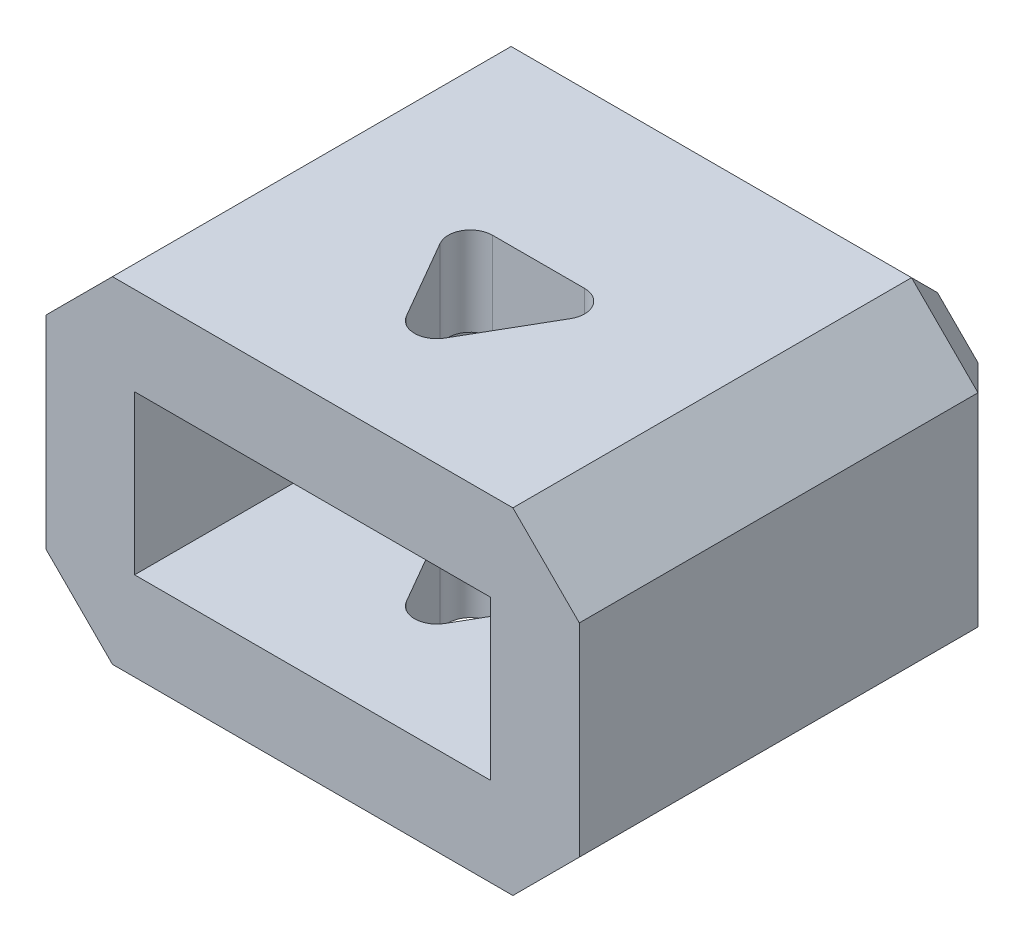
ISO-10303-21;
HEADER;
FILE_DESCRIPTION(('STEP AP214'),'2;1');
FILE_NAME('part.step','',(''),(''),'','','');
FILE_SCHEMA(('AUTOMOTIVE_DESIGN { 1 0 10303 214 1 1 1 1 }'));
ENDSEC;
DATA;
#1=APPLICATION_CONTEXT('core data for automotive mechanical design processes');
#2=APPLICATION_PROTOCOL_DEFINITION('international standard','automotive_design',2000,#1);
#3=PRODUCT_CONTEXT('',#1,'mechanical');
#4=PRODUCT('Part','Part','',(#3));
#5=PRODUCT_RELATED_PRODUCT_CATEGORY('part','',(#4));
#6=PRODUCT_DEFINITION_FORMATION('','',#4);
#7=PRODUCT_DEFINITION_CONTEXT('part definition',#1,'design');
#8=PRODUCT_DEFINITION('design','',#6,#7);
#9=PRODUCT_DEFINITION_SHAPE('','',#8);
#10=(LENGTH_UNIT() NAMED_UNIT(*) SI_UNIT(.MILLI.,.METRE.));
#11=(NAMED_UNIT(*) PLANE_ANGLE_UNIT() SI_UNIT($,.RADIAN.));
#12=(NAMED_UNIT(*) SI_UNIT($,.STERADIAN.) SOLID_ANGLE_UNIT());
#13=UNCERTAINTY_MEASURE_WITH_UNIT(LENGTH_MEASURE(1.E-05),#10,'distance_accuracy_value','');
#14=(GEOMETRIC_REPRESENTATION_CONTEXT(3) GLOBAL_UNCERTAINTY_ASSIGNED_CONTEXT((#13)) GLOBAL_UNIT_ASSIGNED_CONTEXT((#10,
#11,#12)) REPRESENTATION_CONTEXT('',''));
#15=CARTESIAN_POINT('',(0.,0.,0.));
#16=DIRECTION('',(0.,0.,1.));
#17=DIRECTION('',(1.,0.,0.));
#18=AXIS2_PLACEMENT_3D('',#15,#16,#17);
#19=CARTESIAN_POINT('',(0.,0.,8.));
#20=DIRECTION('',(0.,0.,1.));
#21=DIRECTION('',(1.,0.,0.));
#22=AXIS2_PLACEMENT_3D('',#19,#20,#21);
#23=PLANE('',#22);
#24=DIRECTION('',(0.,-1.,0.));
#25=VECTOR('',#24,1.);
#26=CARTESIAN_POINT('',(-6.02,3.79,8.));
#27=LINE('',#26,#25);
#28=CARTESIAN_POINT('',(-6.02,2.29,8.));
#29=VERTEX_POINT('',#28);
#30=CARTESIAN_POINT('',(-6.02,-2.28999999999999,8.));
#31=VERTEX_POINT('',#30);
#32=EDGE_CURVE('E274',#29,#31,#27,.T.);
#33=ORIENTED_EDGE('',*,*,#32,.T.);
#34=DIRECTION('',(-0.707106781186546,0.707106781186549,0.));
#35=VECTOR('',#34,1.);
#36=CARTESIAN_POINT('',(-4.15500000000001,-4.15499999999999,8.));
#37=LINE('',#36,#35);
#38=CARTESIAN_POINT('',(-4.52,-3.79,8.));
#39=VERTEX_POINT('',#38);
#40=EDGE_CURVE('E294',#31,#39,#37,.F.);
#41=ORIENTED_EDGE('',*,*,#40,.T.);
#42=DIRECTION('',(1.,0.,0.));
#43=VECTOR('',#42,1.);
#44=CARTESIAN_POINT('',(-6.02,-3.79,8.));
#45=LINE('',#44,#43);
#46=CARTESIAN_POINT('',(4.52,-3.79,8.));
#47=VERTEX_POINT('',#46);
#48=EDGE_CURVE('E277',#39,#47,#45,.T.);
#49=ORIENTED_EDGE('',*,*,#48,.T.);
#50=DIRECTION('',(-0.707106781186549,-0.707106781186546,0.));
#51=VECTOR('',#50,1.);
#52=CARTESIAN_POINT('',(4.15499999999999,-4.155,8.));
#53=LINE('',#52,#51);
#54=CARTESIAN_POINT('',(6.02,-2.29,8.));
#55=VERTEX_POINT('',#54);
#56=EDGE_CURVE('E288',#47,#55,#53,.F.);
#57=ORIENTED_EDGE('',*,*,#56,.T.);
#58=DIRECTION('',(0.,1.,0.));
#59=VECTOR('',#58,1.);
#60=CARTESIAN_POINT('',(6.02,3.79,8.));
#61=LINE('',#60,#59);
#62=CARTESIAN_POINT('',(6.02,2.29,8.));
#63=VERTEX_POINT('',#62);
#64=EDGE_CURVE('E268',#55,#63,#61,.T.);
#65=ORIENTED_EDGE('',*,*,#64,.T.);
#66=DIRECTION('',(0.707106781186547,-0.707106781186548,0.));
#67=VECTOR('',#66,1.);
#68=CARTESIAN_POINT('',(4.15500000000001,4.155,8.));
#69=LINE('',#68,#67);
#70=CARTESIAN_POINT('',(4.52,3.79,8.));
#71=VERTEX_POINT('',#70);
#72=EDGE_CURVE('E290',#63,#71,#69,.F.);
#73=ORIENTED_EDGE('',*,*,#72,.T.);
#74=DIRECTION('',(-1.,0.,0.));
#75=VECTOR('',#74,1.);
#76=CARTESIAN_POINT('',(-6.02,3.79,8.));
#77=LINE('',#76,#75);
#78=CARTESIAN_POINT('',(-4.52,3.79,8.));
#79=VERTEX_POINT('',#78);
#80=EDGE_CURVE('E271',#71,#79,#77,.T.);
#81=ORIENTED_EDGE('',*,*,#80,.T.);
#82=DIRECTION('',(0.707106781186548,0.707106781186547,0.));
#83=VECTOR('',#82,1.);
#84=CARTESIAN_POINT('',(-4.15499999999999,4.155,8.));
#85=LINE('',#84,#83);
#86=EDGE_CURVE('E292',#79,#29,#85,.F.);
#87=ORIENTED_EDGE('',*,*,#86,.T.);
#88=EDGE_LOOP('',(#33,#41,#49,#57,#65,#73,#81,#87));
#89=FACE_BOUND('',#88,.T.);
#90=DIRECTION('',(1.,0.,0.));
#91=VECTOR('',#90,1.);
#92=CARTESIAN_POINT('',(4.02,-1.79,8.));
#93=LINE('',#92,#91);
#94=CARTESIAN_POINT('',(-4.02,-1.79,8.));
#95=VERTEX_POINT('',#94);
#96=CARTESIAN_POINT('',(4.02,-1.79,8.));
#97=VERTEX_POINT('',#96);
#98=EDGE_CURVE('E259',#95,#97,#93,.T.);
#99=ORIENTED_EDGE('',*,*,#98,.F.);
#100=DIRECTION('',(0.,-1.,0.));
#101=VECTOR('',#100,1.);
#102=CARTESIAN_POINT('',(-4.02,-1.79,8.));
#103=LINE('',#102,#101);
#104=CARTESIAN_POINT('',(-4.02,1.79,8.));
#105=VERTEX_POINT('',#104);
#106=EDGE_CURVE('E257',#105,#95,#103,.T.);
#107=ORIENTED_EDGE('',*,*,#106,.F.);
#108=DIRECTION('',(-1.,0.,0.));
#109=VECTOR('',#108,1.);
#110=CARTESIAN_POINT('',(4.02,1.79,8.));
#111=LINE('',#110,#109);
#112=CARTESIAN_POINT('',(4.02,1.79,8.));
#113=VERTEX_POINT('',#112);
#114=EDGE_CURVE('E238',#113,#105,#111,.T.);
#115=ORIENTED_EDGE('',*,*,#114,.F.);
#116=DIRECTION('',(0.,1.,0.));
#117=VECTOR('',#116,1.);
#118=CARTESIAN_POINT('',(4.02,-1.79,8.));
#119=LINE('',#118,#117);
#120=EDGE_CURVE('E455',#97,#113,#119,.T.);
#121=ORIENTED_EDGE('',*,*,#120,.F.);
#122=EDGE_LOOP('',(#99,#107,#115,#121));
#123=FACE_BOUND('',#122,.T.);
#124=ADVANCED_FACE('F43',(#89,#123),#23,.T.);
#125=CARTESIAN_POINT('',(6.02,3.79,8.));
#126=DIRECTION('',(-1.,0.,0.));
#127=DIRECTION('',(0.,0.,1.));
#128=AXIS2_PLACEMENT_3D('',#125,#126,#127);
#129=PLANE('',#128);
#130=DIRECTION('',(0.,0.,-1.));
#131=VECTOR('',#130,1.);
#132=CARTESIAN_POINT('',(6.02,-2.29,8.));
#133=LINE('',#132,#131);
#134=CARTESIAN_POINT('',(6.02,-2.29,-0.999999999999999));
#135=VERTEX_POINT('',#134);
#136=EDGE_CURVE('E301',#55,#135,#133,.T.);
#137=ORIENTED_EDGE('',*,*,#136,.T.);
#138=DIRECTION('',(0.,1.,0.));
#139=VECTOR('',#138,1.);
#140=CARTESIAN_POINT('',(6.02,3.79,-0.999999999999999));
#141=LINE('',#140,#139);
#142=CARTESIAN_POINT('',(6.02,2.29,-0.999999999999999));
#143=VERTEX_POINT('',#142);
#144=EDGE_CURVE('E389',#135,#143,#141,.T.);
#145=ORIENTED_EDGE('',*,*,#144,.T.);
#146=DIRECTION('',(0.,0.,1.));
#147=VECTOR('',#146,1.);
#148=CARTESIAN_POINT('',(6.02,2.29,8.));
#149=LINE('',#148,#147);
#150=EDGE_CURVE('E304',#143,#63,#149,.T.);
#151=ORIENTED_EDGE('',*,*,#150,.T.);
#152=ORIENTED_EDGE('',*,*,#64,.F.);
#153=EDGE_LOOP('',(#137,#145,#151,#152));
#154=FACE_BOUND('',#153,.T.);
#155=ADVANCED_FACE('F467',(#154),#129,.F.);
#156=CARTESIAN_POINT('',(-6.02,3.79,8.));
#157=DIRECTION('',(0.,-1.,0.));
#158=DIRECTION('',(0.,0.,-1.));
#159=AXIS2_PLACEMENT_3D('',#156,#157,#158);
#160=PLANE('',#159);
#161=DIRECTION('',(1.,0.,0.));
#162=VECTOR('',#161,1.);
#163=CARTESIAN_POINT('',(-1.90525588832576,3.79,2.9));
#164=LINE('',#163,#162);
#165=CARTESIAN_POINT('',(-1.03923048454132,3.79,2.9));
#166=VERTEX_POINT('',#165);
#167=CARTESIAN_POINT('',(1.03923048454133,3.79,2.9));
#168=VERTEX_POINT('',#167);
#169=EDGE_CURVE('E426',#166,#168,#164,.T.);
#170=ORIENTED_EDGE('',*,*,#169,.T.);
#171=CARTESIAN_POINT('',(1.03923048454133,3.79,3.4));
#172=DIRECTION('',(0.,-1.,0.));
#173=DIRECTION('',(0.,0.,-1.));
#174=AXIS2_PLACEMENT_3D('',#171,#172,#173);
#175=CIRCLE('',#174,0.5);
#176=CARTESIAN_POINT('',(1.47224318643355,3.79,3.65));
#177=VERTEX_POINT('',#176);
#178=EDGE_CURVE('E355',#168,#177,#175,.T.);
#179=ORIENTED_EDGE('',*,*,#178,.T.);
#180=DIRECTION('',(-0.500000000000001,0.,0.866025403784438));
#181=VECTOR('',#180,1.);
#182=CARTESIAN_POINT('',(1.90525588832577,3.79,2.9));
#183=LINE('',#182,#181);
#184=CARTESIAN_POINT('',(0.433012701892219,3.79,5.45));
#185=VERTEX_POINT('',#184);
#186=EDGE_CURVE('E432',#177,#185,#183,.T.);
#187=ORIENTED_EDGE('',*,*,#186,.T.);
#188=CARTESIAN_POINT('',(0.,3.79,5.2));
#189=DIRECTION('',(0.,-1.,0.));
#190=DIRECTION('',(0.,0.,-1.));
#191=AXIS2_PLACEMENT_3D('',#188,#189,#190);
#192=CIRCLE('',#191,0.5);
#193=CARTESIAN_POINT('',(-0.433012701892219,3.79,5.45));
#194=VERTEX_POINT('',#193);
#195=EDGE_CURVE('E351',#185,#194,#192,.T.);
#196=ORIENTED_EDGE('',*,*,#195,.T.);
#197=DIRECTION('',(-0.5,0.,-0.866025403784439));
#198=VECTOR('',#197,1.);
#199=CARTESIAN_POINT('',(0.,3.79,6.2));
#200=LINE('',#199,#198);
#201=CARTESIAN_POINT('',(-1.47224318643354,3.79,3.65));
#202=VERTEX_POINT('',#201);
#203=EDGE_CURVE('E420',#194,#202,#200,.T.);
#204=ORIENTED_EDGE('',*,*,#203,.T.);
#205=CARTESIAN_POINT('',(-1.03923048454132,3.79,3.4));
#206=DIRECTION('',(0.,-1.,0.));
#207=DIRECTION('',(0.,0.,-1.));
#208=AXIS2_PLACEMENT_3D('',#205,#206,#207);
#209=CIRCLE('',#208,0.5);
#210=EDGE_CURVE('E347',#202,#166,#209,.T.);
#211=ORIENTED_EDGE('',*,*,#210,.T.);
#212=EDGE_LOOP('',(#170,#179,#187,#196,#204,#211));
#213=FACE_BOUND('',#212,.T.);
#214=DIRECTION('',(0.,0.,-1.));
#215=VECTOR('',#214,1.);
#216=CARTESIAN_POINT('',(4.52,3.79,8.));
#217=LINE('',#216,#215);
#218=CARTESIAN_POINT('',(4.52,3.79,-0.999999999999999));
#219=VERTEX_POINT('',#218);
#220=EDGE_CURVE('E296',#71,#219,#217,.T.);
#221=ORIENTED_EDGE('',*,*,#220,.T.);
#222=DIRECTION('',(-1.,0.,0.));
#223=VECTOR('',#222,1.);
#224=CARTESIAN_POINT('',(-6.02,3.79,-0.999999999999999));
#225=LINE('',#224,#223);
#226=CARTESIAN_POINT('',(-4.52,3.79,-0.999999999999999));
#227=VERTEX_POINT('',#226);
#228=EDGE_CURVE('E393',#219,#227,#225,.T.);
#229=ORIENTED_EDGE('',*,*,#228,.T.);
#230=DIRECTION('',(0.,0.,1.));
#231=VECTOR('',#230,1.);
#232=CARTESIAN_POINT('',(-4.52,3.79,8.));
#233=LINE('',#232,#231);
#234=EDGE_CURVE('E299',#227,#79,#233,.T.);
#235=ORIENTED_EDGE('',*,*,#234,.T.);
#236=ORIENTED_EDGE('',*,*,#80,.F.);
#237=EDGE_LOOP('',(#221,#229,#235,#236));
#238=FACE_BOUND('',#237,.T.);
#239=ADVANCED_FACE('F475',(#213,#238),#160,.F.);
#240=CARTESIAN_POINT('',(-6.02,3.79,8.));
#241=DIRECTION('',(1.,0.,0.));
#242=DIRECTION('',(0.,0.,-1.));
#243=AXIS2_PLACEMENT_3D('',#240,#241,#242);
#244=PLANE('',#243);
#245=DIRECTION('',(0.,0.,-1.));
#246=VECTOR('',#245,1.);
#247=CARTESIAN_POINT('',(-6.02,2.29,8.));
#248=LINE('',#247,#246);
#249=CARTESIAN_POINT('',(-6.02,2.29,-0.999999999999999));
#250=VERTEX_POINT('',#249);
#251=EDGE_CURVE('E284',#29,#250,#248,.T.);
#252=ORIENTED_EDGE('',*,*,#251,.T.);
#253=DIRECTION('',(0.,-1.,0.));
#254=VECTOR('',#253,1.);
#255=CARTESIAN_POINT('',(-6.02,3.79,-0.999999999999999));
#256=LINE('',#255,#254);
#257=CARTESIAN_POINT('',(-6.02,-2.28999999999999,-0.999999999999999));
#258=VERTEX_POINT('',#257);
#259=EDGE_CURVE('E68',#250,#258,#256,.T.);
#260=ORIENTED_EDGE('',*,*,#259,.T.);
#261=DIRECTION('',(0.,0.,1.));
#262=VECTOR('',#261,1.);
#263=CARTESIAN_POINT('',(-6.02,-2.28999999999999,8.));
#264=LINE('',#263,#262);
#265=EDGE_CURVE('E286',#258,#31,#264,.T.);
#266=ORIENTED_EDGE('',*,*,#265,.T.);
#267=ORIENTED_EDGE('',*,*,#32,.F.);
#268=EDGE_LOOP('',(#252,#260,#266,#267));
#269=FACE_BOUND('',#268,.T.);
#270=ADVANCED_FACE('F484',(#269),#244,.F.);
#271=CARTESIAN_POINT('',(-6.02,-3.79,8.));
#272=DIRECTION('',(0.,1.,0.));
#273=DIRECTION('',(0.,0.,1.));
#274=AXIS2_PLACEMENT_3D('',#271,#272,#273);
#275=PLANE('',#274);
#276=DIRECTION('',(0.500000000000001,0.,-0.866025403784438));
#277=VECTOR('',#276,1.);
#278=CARTESIAN_POINT('',(-2.284422863406,-3.79,10.1567364653912));
#279=LINE('',#278,#277);
#280=CARTESIAN_POINT('',(0.43301270189222,-3.79,5.45));
#281=VERTEX_POINT('',#280);
#282=CARTESIAN_POINT('',(1.47224318643355,-3.79,3.65));
#283=VERTEX_POINT('',#282);
#284=EDGE_CURVE('E446',#281,#283,#279,.T.);
#285=ORIENTED_EDGE('',*,*,#284,.T.);
#286=CARTESIAN_POINT('',(1.03923048454133,-3.79,3.4));
#287=DIRECTION('',(0.,1.,0.));
#288=DIRECTION('',(0.,0.,1.));
#289=AXIS2_PLACEMENT_3D('',#286,#287,#288);
#290=CIRCLE('',#289,0.5);
#291=CARTESIAN_POINT('',(1.03923048454133,-3.79,2.9));
#292=VERTEX_POINT('',#291);
#293=EDGE_CURVE('E357',#283,#292,#290,.T.);
#294=ORIENTED_EDGE('',*,*,#293,.T.);
#295=DIRECTION('',(-1.,0.,0.));
#296=VECTOR('',#295,1.);
#297=CARTESIAN_POINT('',(-6.02,-3.79,2.9));
#298=LINE('',#297,#296);
#299=CARTESIAN_POINT('',(-1.03923048454132,-3.79,2.9));
#300=VERTEX_POINT('',#299);
#301=EDGE_CURVE('E440',#292,#300,#298,.T.);
#302=ORIENTED_EDGE('',*,*,#301,.T.);
#303=CARTESIAN_POINT('',(-1.03923048454132,-3.79,3.4));
#304=DIRECTION('',(0.,1.,0.));
#305=DIRECTION('',(0.,0.,1.));
#306=AXIS2_PLACEMENT_3D('',#303,#304,#305);
#307=CIRCLE('',#306,0.5);
#308=CARTESIAN_POINT('',(-1.47224318643354,-3.79,3.65));
#309=VERTEX_POINT('',#308);
#310=EDGE_CURVE('E365',#300,#309,#307,.T.);
#311=ORIENTED_EDGE('',*,*,#310,.T.);
#312=DIRECTION('',(0.5,0.,0.866025403784439));
#313=VECTOR('',#312,1.);
#314=CARTESIAN_POINT('',(-0.725577136594004,-3.79,4.94326353460884));
#315=LINE('',#314,#313);
#316=CARTESIAN_POINT('',(-0.433012701892219,-3.79,5.45));
#317=VERTEX_POINT('',#316);
#318=EDGE_CURVE('E252',#309,#317,#315,.T.);
#319=ORIENTED_EDGE('',*,*,#318,.T.);
#320=CARTESIAN_POINT('',(0.,-3.79,5.2));
#321=DIRECTION('',(0.,1.,0.));
#322=DIRECTION('',(0.,0.,1.));
#323=AXIS2_PLACEMENT_3D('',#320,#321,#322);
#324=CIRCLE('',#323,0.5);
#325=EDGE_CURVE('E361',#317,#281,#324,.T.);
#326=ORIENTED_EDGE('',*,*,#325,.T.);
#327=EDGE_LOOP('',(#285,#294,#302,#311,#319,#326));
#328=FACE_BOUND('',#327,.T.);
#329=DIRECTION('',(0.,0.,-1.));
#330=VECTOR('',#329,1.);
#331=CARTESIAN_POINT('',(-4.52,-3.79,8.));
#332=LINE('',#331,#330);
#333=CARTESIAN_POINT('',(-4.52,-3.79,-0.999999999999999));
#334=VERTEX_POINT('',#333);
#335=EDGE_CURVE('E282',#39,#334,#332,.T.);
#336=ORIENTED_EDGE('',*,*,#335,.T.);
#337=DIRECTION('',(1.,0.,0.));
#338=VECTOR('',#337,1.);
#339=CARTESIAN_POINT('',(-6.02,-3.79,-0.999999999999999));
#340=LINE('',#339,#338);
#341=CARTESIAN_POINT('',(4.52,-3.79,-0.999999999999999));
#342=VERTEX_POINT('',#341);
#343=EDGE_CURVE('E11',#334,#342,#340,.T.);
#344=ORIENTED_EDGE('',*,*,#343,.T.);
#345=DIRECTION('',(0.,0.,1.));
#346=VECTOR('',#345,1.);
#347=CARTESIAN_POINT('',(4.52,-3.79,8.));
#348=LINE('',#347,#346);
#349=EDGE_CURVE('E280',#342,#47,#348,.T.);
#350=ORIENTED_EDGE('',*,*,#349,.T.);
#351=ORIENTED_EDGE('',*,*,#48,.F.);
#352=EDGE_LOOP('',(#336,#344,#350,#351));
#353=FACE_BOUND('',#352,.T.);
#354=ADVANCED_FACE('F481',(#328,#353),#275,.F.);
#355=CARTESIAN_POINT('',(-4.02,-1.79,8.));
#356=DIRECTION('',(1.,0.,0.));
#357=DIRECTION('',(0.,0.,-1.));
#358=AXIS2_PLACEMENT_3D('',#355,#356,#357);
#359=PLANE('',#358);
#360=DIRECTION('',(0.,-1.,0.));
#361=VECTOR('',#360,1.);
#362=CARTESIAN_POINT('',(-4.02,-1.79,0.));
#363=LINE('',#362,#361);
#364=CARTESIAN_POINT('',(-4.02,1.79,0.));
#365=VERTEX_POINT('',#364);
#366=CARTESIAN_POINT('',(-4.02,-1.79,0.));
#367=VERTEX_POINT('',#366);
#368=EDGE_CURVE('E245',#365,#367,#363,.T.);
#369=ORIENTED_EDGE('',*,*,#368,.F.);
#370=DIRECTION('',(0.,0.,-1.));
#371=VECTOR('',#370,1.);
#372=CARTESIAN_POINT('',(-4.02,1.79,8.));
#373=LINE('',#372,#371);
#374=EDGE_CURVE('E231',#105,#365,#373,.T.);
#375=ORIENTED_EDGE('',*,*,#374,.F.);
#376=ORIENTED_EDGE('',*,*,#106,.T.);
#377=DIRECTION('',(0.,0.,-1.));
#378=VECTOR('',#377,1.);
#379=CARTESIAN_POINT('',(-4.02,-1.79,8.));
#380=LINE('',#379,#378);
#381=EDGE_CURVE('E248',#95,#367,#380,.T.);
#382=ORIENTED_EDGE('',*,*,#381,.T.);
#383=EDGE_LOOP('',(#369,#375,#376,#382));
#384=FACE_BOUND('',#383,.T.);
#385=ADVANCED_FACE('F246',(#384),#359,.T.);
#386=CARTESIAN_POINT('',(4.02,-1.79,8.));
#387=DIRECTION('',(0.,1.,0.));
#388=DIRECTION('',(0.,0.,1.));
#389=AXIS2_PLACEMENT_3D('',#386,#387,#388);
#390=PLANE('',#389);
#391=DIRECTION('',(0.5,0.,0.866025403784439));
#392=VECTOR('',#391,1.);
#393=CARTESIAN_POINT('',(1.784422863406,-1.79,9.29071106160672));
#394=LINE('',#393,#392);
#395=CARTESIAN_POINT('',(-1.47224318643354,-1.79,3.65));
#396=VERTEX_POINT('',#395);
#397=CARTESIAN_POINT('',(-0.433012701892219,-1.79,5.45));
#398=VERTEX_POINT('',#397);
#399=EDGE_CURVE('E449',#396,#398,#394,.T.);
#400=ORIENTED_EDGE('',*,*,#399,.F.);
#401=CARTESIAN_POINT('',(-1.03923048454132,-1.79,3.4));
#402=DIRECTION('',(0.,1.,0.));
#403=DIRECTION('',(0.,0.,1.));
#404=AXIS2_PLACEMENT_3D('',#401,#402,#403);
#405=CIRCLE('',#404,0.5);
#406=CARTESIAN_POINT('',(-1.03923048454132,-1.79,2.9));
#407=VERTEX_POINT('',#406);
#408=EDGE_CURVE('E367',#396,#407,#405,.F.);
#409=ORIENTED_EDGE('',*,*,#408,.T.);
#410=DIRECTION('',(-1.,0.,0.));
#411=VECTOR('',#410,1.);
#412=CARTESIAN_POINT('',(4.02,-1.79,2.9));
#413=LINE('',#412,#411);
#414=CARTESIAN_POINT('',(1.03923048454133,-1.79,2.9));
#415=VERTEX_POINT('',#414);
#416=EDGE_CURVE('E437',#415,#407,#413,.T.);
#417=ORIENTED_EDGE('',*,*,#416,.F.);
#418=CARTESIAN_POINT('',(1.03923048454133,-1.79,3.4));
#419=DIRECTION('',(0.,1.,0.));
#420=DIRECTION('',(0.,0.,1.));
#421=AXIS2_PLACEMENT_3D('',#418,#419,#420);
#422=CIRCLE('',#421,0.5);
#423=CARTESIAN_POINT('',(1.47224318643355,-1.79,3.65));
#424=VERTEX_POINT('',#423);
#425=EDGE_CURVE('E359',#415,#424,#422,.F.);
#426=ORIENTED_EDGE('',*,*,#425,.T.);
#427=DIRECTION('',(0.500000000000001,0.,-0.866025403784438));
#428=VECTOR('',#427,1.);
#429=CARTESIAN_POINT('',(0.225577136594005,-1.79,5.80928893839328));
#430=LINE('',#429,#428);
#431=CARTESIAN_POINT('',(0.433012701892219,-1.79,5.45));
#432=VERTEX_POINT('',#431);
#433=EDGE_CURVE('E443',#432,#424,#430,.T.);
#434=ORIENTED_EDGE('',*,*,#433,.F.);
#435=CARTESIAN_POINT('',(0.,-1.79,5.2));
#436=DIRECTION('',(0.,1.,0.));
#437=DIRECTION('',(0.,0.,1.));
#438=AXIS2_PLACEMENT_3D('',#435,#436,#437);
#439=CIRCLE('',#438,0.5);
#440=EDGE_CURVE('E363',#432,#398,#439,.F.);
#441=ORIENTED_EDGE('',*,*,#440,.T.);
#442=EDGE_LOOP('',(#400,#409,#417,#426,#434,#441));
#443=FACE_BOUND('',#442,.T.);
#444=DIRECTION('',(1.,0.,0.));
#445=VECTOR('',#444,1.);
#446=CARTESIAN_POINT('',(4.02,-1.79,0.));
#447=LINE('',#446,#445);
#448=CARTESIAN_POINT('',(4.02,-1.79,0.));
#449=VERTEX_POINT('',#448);
#450=EDGE_CURVE('E251',#367,#449,#447,.T.);
#451=ORIENTED_EDGE('',*,*,#450,.F.);
#452=ORIENTED_EDGE('',*,*,#381,.F.);
#453=ORIENTED_EDGE('',*,*,#98,.T.);
#454=DIRECTION('',(0.,0.,-1.));
#455=VECTOR('',#454,1.);
#456=CARTESIAN_POINT('',(4.02,-1.79,8.));
#457=LINE('',#456,#455);
#458=EDGE_CURVE('E265',#97,#449,#457,.T.);
#459=ORIENTED_EDGE('',*,*,#458,.T.);
#460=EDGE_LOOP('',(#451,#452,#453,#459));
#461=FACE_BOUND('',#460,.T.);
#462=ADVANCED_FACE('F459',(#443,#461),#390,.T.);
#463=CARTESIAN_POINT('',(4.02,-1.79,8.));
#464=DIRECTION('',(-1.,0.,0.));
#465=DIRECTION('',(0.,0.,1.));
#466=AXIS2_PLACEMENT_3D('',#463,#464,#465);
#467=PLANE('',#466);
#468=DIRECTION('',(0.,1.,0.));
#469=VECTOR('',#468,1.);
#470=CARTESIAN_POINT('',(4.02,-1.79,0.));
#471=LINE('',#470,#469);
#472=CARTESIAN_POINT('',(4.02,1.79,0.));
#473=VERTEX_POINT('',#472);
#474=EDGE_CURVE('E256',#449,#473,#471,.T.);
#475=ORIENTED_EDGE('',*,*,#474,.F.);
#476=ORIENTED_EDGE('',*,*,#458,.F.);
#477=ORIENTED_EDGE('',*,*,#120,.T.);
#478=DIRECTION('',(0.,0.,-1.));
#479=VECTOR('',#478,1.);
#480=CARTESIAN_POINT('',(4.02,1.79,8.));
#481=LINE('',#480,#479);
#482=EDGE_CURVE('E241',#113,#473,#481,.T.);
#483=ORIENTED_EDGE('',*,*,#482,.T.);
#484=EDGE_LOOP('',(#475,#476,#477,#483));
#485=FACE_BOUND('',#484,.T.);
#486=ADVANCED_FACE('F464',(#485),#467,.T.);
#487=CARTESIAN_POINT('',(4.02,1.79,8.));
#488=DIRECTION('',(0.,-1.,0.));
#489=DIRECTION('',(0.,0.,-1.));
#490=AXIS2_PLACEMENT_3D('',#487,#488,#489);
#491=PLANE('',#490);
#492=DIRECTION('',(-0.5,0.,-0.866025403784439));
#493=VECTOR('',#492,1.);
#494=CARTESIAN_POINT('',(1.784422863406,1.79,9.29071106160672));
#495=LINE('',#494,#493);
#496=CARTESIAN_POINT('',(-0.433012701892219,1.79,5.45));
#497=VERTEX_POINT('',#496);
#498=CARTESIAN_POINT('',(-1.47224318643354,1.79,3.65));
#499=VERTEX_POINT('',#498);
#500=EDGE_CURVE('E312',#497,#499,#495,.T.);
#501=ORIENTED_EDGE('',*,*,#500,.F.);
#502=CARTESIAN_POINT('',(0.,1.79,5.2));
#503=DIRECTION('',(0.,-1.,0.));
#504=DIRECTION('',(0.,0.,-1.));
#505=AXIS2_PLACEMENT_3D('',#502,#503,#504);
#506=CIRCLE('',#505,0.5);
#507=CARTESIAN_POINT('',(0.433012701892219,1.79,5.45));
#508=VERTEX_POINT('',#507);
#509=EDGE_CURVE('E349',#497,#508,#506,.F.);
#510=ORIENTED_EDGE('',*,*,#509,.T.);
#511=DIRECTION('',(-0.500000000000001,0.,0.866025403784438));
#512=VECTOR('',#511,1.);
#513=CARTESIAN_POINT('',(0.225577136594005,1.79,5.80928893839328));
#514=LINE('',#513,#512);
#515=CARTESIAN_POINT('',(1.47224318643355,1.79,3.65));
#516=VERTEX_POINT('',#515);
#517=EDGE_CURVE('E309',#516,#508,#514,.T.);
#518=ORIENTED_EDGE('',*,*,#517,.F.);
#519=CARTESIAN_POINT('',(1.03923048454133,1.79,3.4));
#520=DIRECTION('',(0.,-1.,0.));
#521=DIRECTION('',(0.,0.,-1.));
#522=AXIS2_PLACEMENT_3D('',#519,#520,#521);
#523=CIRCLE('',#522,0.5);
#524=CARTESIAN_POINT('',(1.03923048454133,1.79,2.9));
#525=VERTEX_POINT('',#524);
#526=EDGE_CURVE('E353',#516,#525,#523,.F.);
#527=ORIENTED_EDGE('',*,*,#526,.T.);
#528=DIRECTION('',(1.,0.,0.));
#529=VECTOR('',#528,1.);
#530=CARTESIAN_POINT('',(4.02,1.79,2.9));
#531=LINE('',#530,#529);
#532=CARTESIAN_POINT('',(-1.03923048454132,1.79,2.9));
#533=VERTEX_POINT('',#532);
#534=EDGE_CURVE('E306',#533,#525,#531,.T.);
#535=ORIENTED_EDGE('',*,*,#534,.F.);
#536=CARTESIAN_POINT('',(-1.03923048454132,1.79,3.4));
#537=DIRECTION('',(0.,-1.,0.));
#538=DIRECTION('',(0.,0.,-1.));
#539=AXIS2_PLACEMENT_3D('',#536,#537,#538);
#540=CIRCLE('',#539,0.5);
#541=EDGE_CURVE('E345',#533,#499,#540,.F.);
#542=ORIENTED_EDGE('',*,*,#541,.T.);
#543=EDGE_LOOP('',(#501,#510,#518,#527,#535,#542));
#544=FACE_BOUND('',#543,.T.);
#545=DIRECTION('',(-1.,0.,0.));
#546=VECTOR('',#545,1.);
#547=CARTESIAN_POINT('',(4.02,1.79,0.));
#548=LINE('',#547,#546);
#549=EDGE_CURVE('E235',#473,#365,#548,.T.);
#550=ORIENTED_EDGE('',*,*,#549,.F.);
#551=ORIENTED_EDGE('',*,*,#482,.F.);
#552=ORIENTED_EDGE('',*,*,#114,.T.);
#553=ORIENTED_EDGE('',*,*,#374,.T.);
#554=EDGE_LOOP('',(#550,#551,#552,#553));
#555=FACE_BOUND('',#554,.T.);
#556=ADVANCED_FACE('F233',(#544,#555),#491,.T.);
#557=CARTESIAN_POINT('',(0.,0.,0.));
#558=DIRECTION('',(0.,0.,1.));
#559=DIRECTION('',(1.,0.,0.));
#560=AXIS2_PLACEMENT_3D('',#557,#558,#559);
#561=PLANE('',#560);
#562=ORIENTED_EDGE('',*,*,#549,.T.);
#563=ORIENTED_EDGE('',*,*,#368,.T.);
#564=ORIENTED_EDGE('',*,*,#450,.T.);
#565=ORIENTED_EDGE('',*,*,#474,.T.);
#566=EDGE_LOOP('',(#562,#563,#564,#565));
#567=FACE_BOUND('',#566,.T.);
#568=ADVANCED_FACE('F254',(#567),#561,.T.);
#569=CARTESIAN_POINT('',(0.,0.,-2.));
#570=DIRECTION('',(0.,0.,1.));
#571=DIRECTION('',(1.,0.,0.));
#572=AXIS2_PLACEMENT_3D('',#569,#570,#571);
#573=PLANE('',#572);
#574=DIRECTION('',(0.,-1.,0.));
#575=VECTOR('',#574,1.);
#576=CARTESIAN_POINT('',(5.02,0.,-2.));
#577=LINE('',#576,#575);
#578=CARTESIAN_POINT('',(5.02,1.8757864376269,-2.));
#579=VERTEX_POINT('',#578);
#580=CARTESIAN_POINT('',(5.02,-1.8757864376269,-2.));
#581=VERTEX_POINT('',#580);
#582=EDGE_CURVE('E381',#579,#581,#577,.T.);
#583=ORIENTED_EDGE('',*,*,#582,.T.);
#584=DIRECTION('',(-0.707106781186549,-0.707106781186546,0.));
#585=VECTOR('',#584,1.);
#586=CARTESIAN_POINT('',(3.81289321881345,-3.08289321881345,-2.));
#587=LINE('',#586,#585);
#588=CARTESIAN_POINT('',(4.1057864376269,-2.79,-2.));
#589=VERTEX_POINT('',#588);
#590=EDGE_CURVE('E383',#581,#589,#587,.T.);
#591=ORIENTED_EDGE('',*,*,#590,.T.);
#592=DIRECTION('',(-1.,0.,0.));
#593=VECTOR('',#592,1.);
#594=CARTESIAN_POINT('',(0.,-2.79,-2.));
#595=LINE('',#594,#593);
#596=CARTESIAN_POINT('',(-4.1057864376269,-2.79,-2.));
#597=VERTEX_POINT('',#596);
#598=EDGE_CURVE('E369',#589,#597,#595,.T.);
#599=ORIENTED_EDGE('',*,*,#598,.T.);
#600=DIRECTION('',(-0.707106781186546,0.707106781186549,0.));
#601=VECTOR('',#600,1.);
#602=CARTESIAN_POINT('',(-5.31289321881345,-1.58289321881345,-2.));
#603=LINE('',#602,#601);
#604=CARTESIAN_POINT('',(-5.02,-1.8757864376269,-2.));
#605=VERTEX_POINT('',#604);
#606=EDGE_CURVE('E371',#597,#605,#603,.T.);
#607=ORIENTED_EDGE('',*,*,#606,.T.);
#608=DIRECTION('',(0.,1.,0.));
#609=VECTOR('',#608,1.);
#610=CARTESIAN_POINT('',(-5.02,0.,-2.));
#611=LINE('',#610,#609);
#612=CARTESIAN_POINT('',(-5.02,1.8757864376269,-2.));
#613=VERTEX_POINT('',#612);
#614=EDGE_CURVE('E373',#605,#613,#611,.T.);
#615=ORIENTED_EDGE('',*,*,#614,.T.);
#616=DIRECTION('',(0.707106781186548,0.707106781186547,0.));
#617=VECTOR('',#616,1.);
#618=CARTESIAN_POINT('',(-3.81289321881345,3.08289321881345,-2.));
#619=LINE('',#618,#617);
#620=CARTESIAN_POINT('',(-4.1057864376269,2.79,-2.));
#621=VERTEX_POINT('',#620);
#622=EDGE_CURVE('E375',#613,#621,#619,.T.);
#623=ORIENTED_EDGE('',*,*,#622,.T.);
#624=DIRECTION('',(1.,0.,0.));
#625=VECTOR('',#624,1.);
#626=CARTESIAN_POINT('',(0.,2.79,-2.));
#627=LINE('',#626,#625);
#628=CARTESIAN_POINT('',(4.10578643762691,2.79,-2.));
#629=VERTEX_POINT('',#628);
#630=EDGE_CURVE('E377',#621,#629,#627,.T.);
#631=ORIENTED_EDGE('',*,*,#630,.T.);
#632=DIRECTION('',(0.707106781186547,-0.707106781186548,0.));
#633=VECTOR('',#632,1.);
#634=CARTESIAN_POINT('',(5.31289321881345,1.58289321881345,-2.));
#635=LINE('',#634,#633);
#636=EDGE_CURVE('E379',#629,#579,#635,.T.);
#637=ORIENTED_EDGE('',*,*,#636,.T.);
#638=EDGE_LOOP('',(#583,#591,#599,#607,#615,#623,#631,#637));
#639=FACE_BOUND('',#638,.T.);
#640=ADVANCED_FACE('F498',(#639),#573,.F.);
#641=CARTESIAN_POINT('',(-4.52,-3.79,8.));
#642=DIRECTION('',(0.707106781186549,0.707106781186546,0.));
#643=DIRECTION('',(0.,0.,-1.));
#644=AXIS2_PLACEMENT_3D('',#641,#642,#643);
#645=PLANE('',#644);
#646=ORIENTED_EDGE('',*,*,#265,.F.);
#647=DIRECTION('',(-0.707106781186546,0.707106781186549,0.));
#648=VECTOR('',#647,1.);
#649=CARTESIAN_POINT('',(-4.52,-3.79,-0.999999999999999));
#650=LINE('',#649,#648);
#651=EDGE_CURVE('E53',#258,#334,#650,.F.);
#652=ORIENTED_EDGE('',*,*,#651,.T.);
#653=ORIENTED_EDGE('',*,*,#335,.F.);
#654=ORIENTED_EDGE('',*,*,#40,.F.);
#655=EDGE_LOOP('',(#646,#652,#653,#654));
#656=FACE_BOUND('',#655,.T.);
#657=ADVANCED_FACE('F491',(#656),#645,.F.);
#658=CARTESIAN_POINT('',(-6.02,2.29,8.));
#659=DIRECTION('',(0.707106781186547,-0.707106781186548,0.));
#660=DIRECTION('',(0.,0.,-1.));
#661=AXIS2_PLACEMENT_3D('',#658,#659,#660);
#662=PLANE('',#661);
#663=ORIENTED_EDGE('',*,*,#234,.F.);
#664=DIRECTION('',(0.707106781186548,0.707106781186547,0.));
#665=VECTOR('',#664,1.);
#666=CARTESIAN_POINT('',(-6.02,2.29,-0.999999999999999));
#667=LINE('',#666,#665);
#668=EDGE_CURVE('E395',#227,#250,#667,.F.);
#669=ORIENTED_EDGE('',*,*,#668,.T.);
#670=ORIENTED_EDGE('',*,*,#251,.F.);
#671=ORIENTED_EDGE('',*,*,#86,.F.);
#672=EDGE_LOOP('',(#663,#669,#670,#671));
#673=FACE_BOUND('',#672,.T.);
#674=ADVANCED_FACE('F497',(#673),#662,.F.);
#675=CARTESIAN_POINT('',(4.52,3.79,8.));
#676=DIRECTION('',(-0.707106781186548,-0.707106781186547,0.));
#677=DIRECTION('',(0.,0.,-1.));
#678=AXIS2_PLACEMENT_3D('',#675,#676,#677);
#679=PLANE('',#678);
#680=ORIENTED_EDGE('',*,*,#150,.F.);
#681=DIRECTION('',(0.707106781186547,-0.707106781186548,0.));
#682=VECTOR('',#681,1.);
#683=CARTESIAN_POINT('',(4.52,3.79,-0.999999999999999));
#684=LINE('',#683,#682);
#685=EDGE_CURVE('E391',#143,#219,#684,.F.);
#686=ORIENTED_EDGE('',*,*,#685,.T.);
#687=ORIENTED_EDGE('',*,*,#220,.F.);
#688=ORIENTED_EDGE('',*,*,#72,.F.);
#689=EDGE_LOOP('',(#680,#686,#687,#688));
#690=FACE_BOUND('',#689,.T.);
#691=ADVANCED_FACE('F504',(#690),#679,.F.);
#692=CARTESIAN_POINT('',(6.02,-2.29,8.));
#693=DIRECTION('',(-0.707106781186546,0.707106781186549,0.));
#694=DIRECTION('',(0.,0.,-1.));
#695=AXIS2_PLACEMENT_3D('',#692,#693,#694);
#696=PLANE('',#695);
#697=ORIENTED_EDGE('',*,*,#349,.F.);
#698=DIRECTION('',(-0.707106781186549,-0.707106781186546,0.));
#699=VECTOR('',#698,1.);
#700=CARTESIAN_POINT('',(6.02,-2.29,-0.999999999999999));
#701=LINE('',#700,#699);
#702=EDGE_CURVE('E386',#342,#135,#701,.F.);
#703=ORIENTED_EDGE('',*,*,#702,.T.);
#704=ORIENTED_EDGE('',*,*,#136,.F.);
#705=ORIENTED_EDGE('',*,*,#56,.F.);
#706=EDGE_LOOP('',(#697,#703,#704,#705));
#707=FACE_BOUND('',#706,.T.);
#708=ADVANCED_FACE('F511',(#707),#696,.F.);
#709=CARTESIAN_POINT('',(-1.90525588832576,3.79,2.9));
#710=DIRECTION('',(0.,0.,-1.));
#711=DIRECTION('',(-1.,0.,0.));
#712=AXIS2_PLACEMENT_3D('',#709,#710,#711);
#713=PLANE('',#712);
#714=ORIENTED_EDGE('',*,*,#169,.F.);
#715=DIRECTION('',(0.,-1.,0.));
#716=VECTOR('',#715,1.);
#717=CARTESIAN_POINT('',(-1.03923048454132,1.79,2.9));
#718=LINE('',#717,#716);
#719=EDGE_CURVE('E317',#166,#533,#718,.T.);
#720=ORIENTED_EDGE('',*,*,#719,.T.);
#721=ORIENTED_EDGE('',*,*,#534,.T.);
#722=DIRECTION('',(0.,-1.,0.));
#723=VECTOR('',#722,1.);
#724=CARTESIAN_POINT('',(1.03923048454133,3.79,2.9));
#725=LINE('',#724,#723);
#726=EDGE_CURVE('E315',#525,#168,#725,.F.);
#727=ORIENTED_EDGE('',*,*,#726,.T.);
#728=EDGE_LOOP('',(#714,#720,#721,#727));
#729=FACE_BOUND('',#728,.T.);
#730=ADVANCED_FACE('F517',(#729),#713,.F.);
#731=CARTESIAN_POINT('',(1.90525588832577,3.79,2.9));
#732=DIRECTION('',(0.866025403784438,0.,0.500000000000001));
#733=DIRECTION('',(0.500000000000001,0.,-0.866025403784438));
#734=AXIS2_PLACEMENT_3D('',#731,#732,#733);
#735=PLANE('',#734);
#736=ORIENTED_EDGE('',*,*,#517,.T.);
#737=DIRECTION('',(0.,-1.,0.));
#738=VECTOR('',#737,1.);
#739=CARTESIAN_POINT('',(0.43301270189222,3.79,5.45));
#740=LINE('',#739,#738);
#741=EDGE_CURVE('E328',#508,#185,#740,.F.);
#742=ORIENTED_EDGE('',*,*,#741,.T.);
#743=ORIENTED_EDGE('',*,*,#186,.F.);
#744=DIRECTION('',(0.,-1.,0.));
#745=VECTOR('',#744,1.);
#746=CARTESIAN_POINT('',(1.47224318643355,1.79,3.65));
#747=LINE('',#746,#745);
#748=EDGE_CURVE('E325',#177,#516,#747,.T.);
#749=ORIENTED_EDGE('',*,*,#748,.T.);
#750=EDGE_LOOP('',(#736,#742,#743,#749));
#751=FACE_BOUND('',#750,.T.);
#752=ADVANCED_FACE('F672',(#751),#735,.F.);
#753=CARTESIAN_POINT('',(0.,3.79,6.2));
#754=DIRECTION('',(-0.866025403784439,0.,0.5));
#755=DIRECTION('',(0.5,0.,0.866025403784439));
#756=AXIS2_PLACEMENT_3D('',#753,#754,#755);
#757=PLANE('',#756);
#758=ORIENTED_EDGE('',*,*,#500,.T.);
#759=DIRECTION('',(0.,-1.,0.));
#760=VECTOR('',#759,1.);
#761=CARTESIAN_POINT('',(-1.47224318643354,3.79,3.65));
#762=LINE('',#761,#760);
#763=EDGE_CURVE('E323',#499,#202,#762,.F.);
#764=ORIENTED_EDGE('',*,*,#763,.T.);
#765=ORIENTED_EDGE('',*,*,#203,.F.);
#766=DIRECTION('',(0.,-1.,0.));
#767=VECTOR('',#766,1.);
#768=CARTESIAN_POINT('',(-0.433012701892219,1.79,5.45));
#769=LINE('',#768,#767);
#770=EDGE_CURVE('E320',#194,#497,#769,.T.);
#771=ORIENTED_EDGE('',*,*,#770,.T.);
#772=EDGE_LOOP('',(#758,#764,#765,#771));
#773=FACE_BOUND('',#772,.T.);
#774=ADVANCED_FACE('F635',(#773),#757,.F.);
#775=ORIENTED_EDGE('',*,*,#399,.T.);
#776=DIRECTION('',(0.,-1.,0.));
#777=VECTOR('',#776,1.);
#778=CARTESIAN_POINT('',(-0.433012701892219,-3.79,5.45));
#779=LINE('',#778,#777);
#780=EDGE_CURVE('E342',#398,#317,#779,.T.);
#781=ORIENTED_EDGE('',*,*,#780,.T.);
#782=ORIENTED_EDGE('',*,*,#318,.F.);
#783=DIRECTION('',(0.,-1.,0.));
#784=VECTOR('',#783,1.);
#785=CARTESIAN_POINT('',(-1.47224318643354,-1.79,3.65));
#786=LINE('',#785,#784);
#787=EDGE_CURVE('E340',#309,#396,#786,.F.);
#788=ORIENTED_EDGE('',*,*,#787,.T.);
#789=EDGE_LOOP('',(#775,#781,#782,#788));
#790=FACE_BOUND('',#789,.T.);
#791=ADVANCED_FACE('F665',(#790),#757,.F.);
#792=ORIENTED_EDGE('',*,*,#433,.T.);
#793=DIRECTION('',(0.,-1.,0.));
#794=VECTOR('',#793,1.);
#795=CARTESIAN_POINT('',(1.47224318643355,-3.79,3.65));
#796=LINE('',#795,#794);
#797=EDGE_CURVE('E332',#424,#283,#796,.T.);
#798=ORIENTED_EDGE('',*,*,#797,.T.);
#799=ORIENTED_EDGE('',*,*,#284,.F.);
#800=DIRECTION('',(0.,-1.,0.));
#801=VECTOR('',#800,1.);
#802=CARTESIAN_POINT('',(0.43301270189222,-1.79,5.45));
#803=LINE('',#802,#801);
#804=EDGE_CURVE('E330',#281,#432,#803,.F.);
#805=ORIENTED_EDGE('',*,*,#804,.T.);
#806=EDGE_LOOP('',(#792,#798,#799,#805));
#807=FACE_BOUND('',#806,.T.);
#808=ADVANCED_FACE('F663',(#807),#735,.F.);
#809=ORIENTED_EDGE('',*,*,#301,.F.);
#810=DIRECTION('',(0.,-1.,0.));
#811=VECTOR('',#810,1.);
#812=CARTESIAN_POINT('',(1.03923048454133,-1.79,2.9));
#813=LINE('',#812,#811);
#814=EDGE_CURVE('E338',#292,#415,#813,.F.);
#815=ORIENTED_EDGE('',*,*,#814,.T.);
#816=ORIENTED_EDGE('',*,*,#416,.T.);
#817=DIRECTION('',(0.,-1.,0.));
#818=VECTOR('',#817,1.);
#819=CARTESIAN_POINT('',(-1.03923048454132,-3.79,2.9));
#820=LINE('',#819,#818);
#821=EDGE_CURVE('E335',#407,#300,#820,.T.);
#822=ORIENTED_EDGE('',*,*,#821,.T.);
#823=EDGE_LOOP('',(#809,#815,#816,#822));
#824=FACE_BOUND('',#823,.T.);
#825=ADVANCED_FACE('F523',(#824),#713,.F.);
#826=CARTESIAN_POINT('',(-1.03923048454132,3.79,3.4));
#827=DIRECTION('',(0.,1.,0.));
#828=DIRECTION('',(0.,0.,1.));
#829=AXIS2_PLACEMENT_3D('',#826,#827,#828);
#830=CYLINDRICAL_SURFACE('',#829,0.5);
#831=ORIENTED_EDGE('',*,*,#210,.F.);
#832=ORIENTED_EDGE('',*,*,#763,.F.);
#833=ORIENTED_EDGE('',*,*,#541,.F.);
#834=ORIENTED_EDGE('',*,*,#719,.F.);
#835=EDGE_LOOP('',(#831,#832,#833,#834));
#836=FACE_BOUND('',#835,.T.);
#837=ADVANCED_FACE('F519',(#836),#830,.F.);
#838=CARTESIAN_POINT('',(0.,3.79,5.2));
#839=DIRECTION('',(0.,1.,0.));
#840=DIRECTION('',(0.,0.,1.));
#841=AXIS2_PLACEMENT_3D('',#838,#839,#840);
#842=CYLINDRICAL_SURFACE('',#841,0.5);
#843=ORIENTED_EDGE('',*,*,#195,.F.);
#844=ORIENTED_EDGE('',*,*,#741,.F.);
#845=ORIENTED_EDGE('',*,*,#509,.F.);
#846=ORIENTED_EDGE('',*,*,#770,.F.);
#847=EDGE_LOOP('',(#843,#844,#845,#846));
#848=FACE_BOUND('',#847,.T.);
#849=ADVANCED_FACE('F522',(#848),#842,.F.);
#850=CARTESIAN_POINT('',(1.03923048454133,3.79,3.4));
#851=DIRECTION('',(0.,1.,0.));
#852=DIRECTION('',(0.,0.,1.));
#853=AXIS2_PLACEMENT_3D('',#850,#851,#852);
#854=CYLINDRICAL_SURFACE('',#853,0.5);
#855=ORIENTED_EDGE('',*,*,#178,.F.);
#856=ORIENTED_EDGE('',*,*,#726,.F.);
#857=ORIENTED_EDGE('',*,*,#526,.F.);
#858=ORIENTED_EDGE('',*,*,#748,.F.);
#859=EDGE_LOOP('',(#855,#856,#857,#858));
#860=FACE_BOUND('',#859,.T.);
#861=ADVANCED_FACE('F527',(#860),#854,.F.);
#862=CARTESIAN_POINT('',(1.03923048454133,3.79,3.4));
#863=DIRECTION('',(0.,1.,0.));
#864=DIRECTION('',(0.,0.,1.));
#865=AXIS2_PLACEMENT_3D('',#862,#863,#864);
#866=CYLINDRICAL_SURFACE('',#865,0.5);
#867=ORIENTED_EDGE('',*,*,#425,.F.);
#868=ORIENTED_EDGE('',*,*,#814,.F.);
#869=ORIENTED_EDGE('',*,*,#293,.F.);
#870=ORIENTED_EDGE('',*,*,#797,.F.);
#871=EDGE_LOOP('',(#867,#868,#869,#870));
#872=FACE_BOUND('',#871,.T.);
#873=ADVANCED_FACE('F531',(#872),#866,.F.);
#874=CARTESIAN_POINT('',(0.,3.79,5.2));
#875=DIRECTION('',(0.,1.,0.));
#876=DIRECTION('',(0.,0.,1.));
#877=AXIS2_PLACEMENT_3D('',#874,#875,#876);
#878=CYLINDRICAL_SURFACE('',#877,0.5);
#879=ORIENTED_EDGE('',*,*,#440,.F.);
#880=ORIENTED_EDGE('',*,*,#804,.F.);
#881=ORIENTED_EDGE('',*,*,#325,.F.);
#882=ORIENTED_EDGE('',*,*,#780,.F.);
#883=EDGE_LOOP('',(#879,#880,#881,#882));
#884=FACE_BOUND('',#883,.T.);
#885=ADVANCED_FACE('F535',(#884),#878,.F.);
#886=CARTESIAN_POINT('',(-1.03923048454132,3.79,3.4));
#887=DIRECTION('',(0.,1.,0.));
#888=DIRECTION('',(0.,0.,1.));
#889=AXIS2_PLACEMENT_3D('',#886,#887,#888);
#890=CYLINDRICAL_SURFACE('',#889,0.5);
#891=ORIENTED_EDGE('',*,*,#408,.F.);
#892=ORIENTED_EDGE('',*,*,#787,.F.);
#893=ORIENTED_EDGE('',*,*,#310,.F.);
#894=ORIENTED_EDGE('',*,*,#821,.F.);
#895=EDGE_LOOP('',(#891,#892,#893,#894));
#896=FACE_BOUND('',#895,.T.);
#897=ADVANCED_FACE('F539',(#896),#890,.F.);
#898=CARTESIAN_POINT('',(-3.44789321881344,3.44789321881345,-2.));
#899=DIRECTION('',(0.499999999999999,-0.5,0.707106781186548));
#900=DIRECTION('',(0.707106781186548,0.707106781186547,0.));
#901=AXIS2_PLACEMENT_3D('',#898,#899,#900);
#902=PLANE('',#901);
#903=DIRECTION('',(0.678598344545847,-0.281084637714821,-0.678598344545846));
#904=VECTOR('',#903,1.);
#905=CARTESIAN_POINT('',(-6.30611535474582,2.40851286033891,-0.71388464525418));
#906=LINE('',#905,#904);
#907=EDGE_CURVE('E414',#250,#613,#906,.T.);
#908=ORIENTED_EDGE('',*,*,#907,.F.);
#909=ORIENTED_EDGE('',*,*,#668,.F.);
#910=DIRECTION('',(0.28108463771482,-0.678598344545848,-0.678598344545847));
#911=VECTOR('',#910,1.);
#912=CARTESIAN_POINT('',(-4.17929613397792,2.96746810589655,-1.82253189410344));
#913=LINE('',#912,#911);
#914=EDGE_CURVE('E48',#621,#227,#913,.F.);
#915=ORIENTED_EDGE('',*,*,#914,.F.);
#916=ORIENTED_EDGE('',*,*,#622,.F.);
#917=EDGE_LOOP('',(#908,#909,#915,#916));
#918=FACE_BOUND('',#917,.T.);
#919=ADVANCED_FACE('F46',(#918),#902,.F.);
#920=CARTESIAN_POINT('',(0.,2.79,-2.));
#921=DIRECTION('',(0.,-0.707106781186547,0.707106781186548));
#922=DIRECTION('',(1.,0.,0.));
#923=AXIS2_PLACEMENT_3D('',#920,#921,#922);
#924=PLANE('',#923);
#925=ORIENTED_EDGE('',*,*,#914,.T.);
#926=ORIENTED_EDGE('',*,*,#228,.F.);
#927=DIRECTION('',(-0.281084637714821,-0.678598344545847,-0.678598344545846));
#928=VECTOR('',#927,1.);
#929=CARTESIAN_POINT('',(3.781394107851,2.0068476379252,-2.7831523620748));
#930=LINE('',#929,#928);
#931=EDGE_CURVE('E412',#629,#219,#930,.F.);
#932=ORIENTED_EDGE('',*,*,#931,.F.);
#933=ORIENTED_EDGE('',*,*,#630,.F.);
#934=EDGE_LOOP('',(#925,#926,#932,#933));
#935=FACE_BOUND('',#934,.T.);
#936=ADVANCED_FACE('F585',(#935),#924,.F.);
#937=CARTESIAN_POINT('',(-6.02,3.79,-0.999999999999999));
#938=DIRECTION('',(0.707106781186547,0.,0.707106781186548));
#939=DIRECTION('',(0.,-1.,0.));
#940=AXIS2_PLACEMENT_3D('',#937,#938,#939);
#941=PLANE('',#940);
#942=ORIENTED_EDGE('',*,*,#907,.T.);
#943=ORIENTED_EDGE('',*,*,#614,.F.);
#944=DIRECTION('',(0.678598344545848,0.281084637714819,-0.678598344545847));
#945=VECTOR('',#944,1.);
#946=CARTESIAN_POINT('',(-4.59592082613726,-1.70012709229298,-2.42407917386274));
#947=LINE('',#946,#945);
#948=EDGE_CURVE('E409',#258,#605,#947,.T.);
#949=ORIENTED_EDGE('',*,*,#948,.F.);
#950=ORIENTED_EDGE('',*,*,#259,.F.);
#951=EDGE_LOOP('',(#942,#943,#949,#950));
#952=FACE_BOUND('',#951,.T.);
#953=ADVANCED_FACE('F579',(#952),#941,.F.);
#954=CARTESIAN_POINT('',(3.44789321881346,3.44789321881345,-2.));
#955=DIRECTION('',(-0.5,-0.499999999999999,0.707106781186548));
#956=DIRECTION('',(0.707106781186547,-0.707106781186548,0.));
#957=AXIS2_PLACEMENT_3D('',#954,#955,#956);
#958=PLANE('',#957);
#959=ORIENTED_EDGE('',*,*,#931,.T.);
#960=ORIENTED_EDGE('',*,*,#685,.F.);
#961=DIRECTION('',(-0.678598344545848,-0.28108463771482,-0.678598344545846));
#962=VECTOR('',#961,1.);
#963=CARTESIAN_POINT('',(4.59592082613726,1.70012709229298,-2.42407917386274));
#964=LINE('',#963,#962);
#965=EDGE_CURVE('E406',#579,#143,#964,.F.);
#966=ORIENTED_EDGE('',*,*,#965,.F.);
#967=ORIENTED_EDGE('',*,*,#636,.F.);
#968=EDGE_LOOP('',(#959,#960,#966,#967));
#969=FACE_BOUND('',#968,.T.);
#970=ADVANCED_FACE('F572',(#969),#958,.F.);
#971=CARTESIAN_POINT('',(-3.44789321881346,-3.44789321881345,-2.));
#972=DIRECTION('',(0.500000000000001,0.499999999999999,0.707106781186548));
#973=DIRECTION('',(-0.707106781186546,0.707106781186549,0.));
#974=AXIS2_PLACEMENT_3D('',#971,#972,#973);
#975=PLANE('',#974);
#976=ORIENTED_EDGE('',*,*,#948,.T.);
#977=ORIENTED_EDGE('',*,*,#606,.F.);
#978=DIRECTION('',(0.28108463771482,0.678598344545847,-0.678598344545846));
#979=VECTOR('',#978,1.);
#980=CARTESIAN_POINT('',(-4.63851286033891,-4.07611535474582,-0.71388464525418));
#981=LINE('',#980,#979);
#982=EDGE_CURVE('E403',#334,#597,#981,.T.);
#983=ORIENTED_EDGE('',*,*,#982,.F.);
#984=ORIENTED_EDGE('',*,*,#651,.F.);
#985=EDGE_LOOP('',(#976,#977,#983,#984));
#986=FACE_BOUND('',#985,.T.);
#987=ADVANCED_FACE('F565',(#986),#975,.F.);
#988=CARTESIAN_POINT('',(5.02,0.,-2.));
#989=DIRECTION('',(-0.707106781186547,0.,0.707106781186548));
#990=DIRECTION('',(0.,-1.,0.));
#991=AXIS2_PLACEMENT_3D('',#988,#989,#990);
#992=PLANE('',#991);
#993=ORIENTED_EDGE('',*,*,#965,.T.);
#994=ORIENTED_EDGE('',*,*,#144,.F.);
#995=DIRECTION('',(-0.678598344545847,0.281084637714821,-0.678598344545846));
#996=VECTOR('',#995,1.);
#997=CARTESIAN_POINT('',(4.66220579864732,-1.72758322688817,-2.35779420135268));
#998=LINE('',#997,#996);
#999=EDGE_CURVE('E401',#581,#135,#998,.F.);
#1000=ORIENTED_EDGE('',*,*,#999,.F.);
#1001=ORIENTED_EDGE('',*,*,#582,.F.);
#1002=EDGE_LOOP('',(#993,#994,#1000,#1001));
#1003=FACE_BOUND('',#1002,.T.);
#1004=ADVANCED_FACE('F558',(#1003),#992,.F.);
#1005=CARTESIAN_POINT('',(-6.02,-3.79,-0.999999999999999));
#1006=DIRECTION('',(0.,0.707106781186547,0.707106781186548));
#1007=DIRECTION('',(1.,0.,0.));
#1008=AXIS2_PLACEMENT_3D('',#1005,#1006,#1007);
#1009=PLANE('',#1008);
#1010=ORIENTED_EDGE('',*,*,#982,.T.);
#1011=ORIENTED_EDGE('',*,*,#598,.F.);
#1012=DIRECTION('',(0.28108463771482,-0.678598344545848,0.678598344545847));
#1013=VECTOR('',#1012,1.);
#1014=CARTESIAN_POINT('',(3.68724963468528,-1.77956277398605,-3.01043722601395));
#1015=LINE('',#1014,#1013);
#1016=EDGE_CURVE('E399',#342,#589,#1015,.F.);
#1017=ORIENTED_EDGE('',*,*,#1016,.F.);
#1018=ORIENTED_EDGE('',*,*,#343,.F.);
#1019=EDGE_LOOP('',(#1010,#1011,#1017,#1018));
#1020=FACE_BOUND('',#1019,.T.);
#1021=ADVANCED_FACE('F551',(#1020),#1009,.F.);
#1022=CARTESIAN_POINT('',(3.44789321881344,-3.44789321881345,-2.));
#1023=DIRECTION('',(-0.499999999999999,0.500000000000001,0.707106781186548));
#1024=DIRECTION('',(-0.707106781186549,-0.707106781186546,0.));
#1025=AXIS2_PLACEMENT_3D('',#1022,#1023,#1024);
#1026=PLANE('',#1025);
#1027=ORIENTED_EDGE('',*,*,#999,.T.);
#1028=ORIENTED_EDGE('',*,*,#702,.F.);
#1029=ORIENTED_EDGE('',*,*,#1016,.T.);
#1030=ORIENTED_EDGE('',*,*,#590,.F.);
#1031=EDGE_LOOP('',(#1027,#1028,#1029,#1030));
#1032=FACE_BOUND('',#1031,.T.);
#1033=ADVANCED_FACE('F545',(#1032),#1026,.F.);
#1034=CLOSED_SHELL('',(#124,#155,#239,#270,#354,#385,#462,#486,#556,#568,#640,#657,#674,#691,
#708,#730,#752,#774,#791,#808,#825,#837,#849,#861,#873,#885,#897,#919,#936,#953,#970,#987,#1004,
#1021,#1033));
#1035=MANIFOLD_SOLID_BREP('B2',#1034);
#1036=ADVANCED_BREP_SHAPE_REPRESENTATION('',(#18,#1035),#14);
#1037=SHAPE_DEFINITION_REPRESENTATION(#9,#1036);
ENDSEC;
END-ISO-10303-21;
